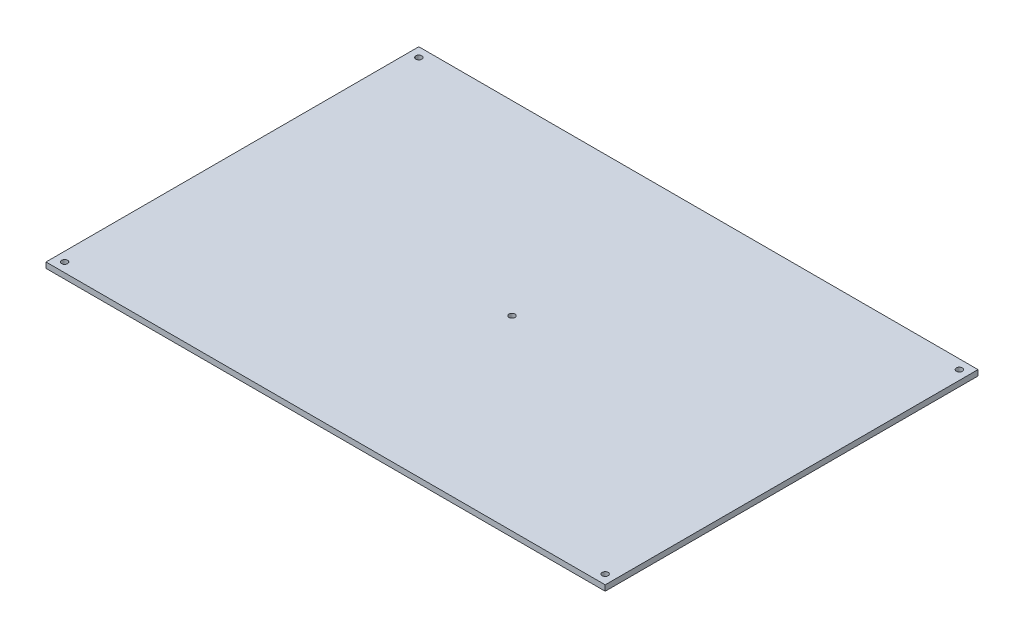
ISO-10303-21;
HEADER;
FILE_DESCRIPTION(('STEP AP214'),'2;1');
FILE_NAME('part.step','',(''),(''),'','','');
FILE_SCHEMA(('AUTOMOTIVE_DESIGN { 1 0 10303 214 1 1 1 1 }'));
ENDSEC;
DATA;
#1=APPLICATION_CONTEXT('core data for automotive mechanical design processes');
#2=APPLICATION_PROTOCOL_DEFINITION('international standard','automotive_design',2000,#1);
#3=PRODUCT_CONTEXT('',#1,'mechanical');
#4=PRODUCT('Part','Part','',(#3));
#5=PRODUCT_RELATED_PRODUCT_CATEGORY('part','',(#4));
#6=PRODUCT_DEFINITION_FORMATION('','',#4);
#7=PRODUCT_DEFINITION_CONTEXT('part definition',#1,'design');
#8=PRODUCT_DEFINITION('design','',#6,#7);
#9=PRODUCT_DEFINITION_SHAPE('','',#8);
#10=(LENGTH_UNIT() NAMED_UNIT(*) SI_UNIT(.MILLI.,.METRE.));
#11=(NAMED_UNIT(*) PLANE_ANGLE_UNIT() SI_UNIT($,.RADIAN.));
#12=(NAMED_UNIT(*) SI_UNIT($,.STERADIAN.) SOLID_ANGLE_UNIT());
#13=UNCERTAINTY_MEASURE_WITH_UNIT(LENGTH_MEASURE(1.E-05),#10,'distance_accuracy_value','');
#14=(GEOMETRIC_REPRESENTATION_CONTEXT(3) GLOBAL_UNCERTAINTY_ASSIGNED_CONTEXT((#13)) GLOBAL_UNIT_ASSIGNED_CONTEXT((#10,
#11,#12)) REPRESENTATION_CONTEXT('',''));
#15=CARTESIAN_POINT('',(0.,0.,0.));
#16=DIRECTION('',(0.,0.,1.));
#17=DIRECTION('',(1.,0.,0.));
#18=AXIS2_PLACEMENT_3D('',#15,#16,#17);
#19=CARTESIAN_POINT('',(150.,-3.,100.));
#20=DIRECTION('',(1.,0.,0.));
#21=DIRECTION('',(0.,0.,-1.));
#22=AXIS2_PLACEMENT_3D('',#19,#20,#21);
#23=PLANE('',#22);
#24=DIRECTION('',(0.,0.,-1.));
#25=VECTOR('',#24,1.);
#26=CARTESIAN_POINT('',(150.,0.,100.));
#27=LINE('',#26,#25);
#28=CARTESIAN_POINT('',(150.,0.,100.));
#29=VERTEX_POINT('',#28);
#30=CARTESIAN_POINT('',(150.,0.,-100.));
#31=VERTEX_POINT('',#30);
#32=EDGE_CURVE('E100',#29,#31,#27,.T.);
#33=ORIENTED_EDGE('',*,*,#32,.F.);
#34=DIRECTION('',(0.,1.,0.));
#35=VECTOR('',#34,1.);
#36=CARTESIAN_POINT('',(150.,-3.,100.));
#37=LINE('',#36,#35);
#38=CARTESIAN_POINT('',(150.,-3.,100.));
#39=VERTEX_POINT('',#38);
#40=EDGE_CURVE('E11',#39,#29,#37,.T.);
#41=ORIENTED_EDGE('',*,*,#40,.F.);
#42=DIRECTION('',(0.,0.,-1.));
#43=VECTOR('',#42,1.);
#44=CARTESIAN_POINT('',(150.,-3.,100.));
#45=LINE('',#44,#43);
#46=CARTESIAN_POINT('',(150.,-3.,-100.));
#47=VERTEX_POINT('',#46);
#48=EDGE_CURVE('E93',#39,#47,#45,.T.);
#49=ORIENTED_EDGE('',*,*,#48,.T.);
#50=DIRECTION('',(0.,1.,0.));
#51=VECTOR('',#50,1.);
#52=CARTESIAN_POINT('',(150.,-3.,-100.));
#53=LINE('',#52,#51);
#54=EDGE_CURVE('E38',#47,#31,#53,.T.);
#55=ORIENTED_EDGE('',*,*,#54,.T.);
#56=EDGE_LOOP('',(#33,#41,#49,#55));
#57=FACE_BOUND('',#56,.T.);
#58=ADVANCED_FACE('F35',(#57),#23,.T.);
#59=CARTESIAN_POINT('',(-150.,-3.,100.));
#60=DIRECTION('',(0.,0.,1.));
#61=DIRECTION('',(1.,0.,0.));
#62=AXIS2_PLACEMENT_3D('',#59,#60,#61);
#63=PLANE('',#62);
#64=DIRECTION('',(1.,0.,0.));
#65=VECTOR('',#64,1.);
#66=CARTESIAN_POINT('',(-150.,0.,100.));
#67=LINE('',#66,#65);
#68=CARTESIAN_POINT('',(-150.,0.,100.));
#69=VERTEX_POINT('',#68);
#70=EDGE_CURVE('E95',#69,#29,#67,.T.);
#71=ORIENTED_EDGE('',*,*,#70,.F.);
#72=DIRECTION('',(0.,1.,0.));
#73=VECTOR('',#72,1.);
#74=CARTESIAN_POINT('',(-150.,-3.,100.));
#75=LINE('',#74,#73);
#76=CARTESIAN_POINT('',(-150.,-3.,100.));
#77=VERTEX_POINT('',#76);
#78=EDGE_CURVE('E44',#77,#69,#75,.T.);
#79=ORIENTED_EDGE('',*,*,#78,.F.);
#80=DIRECTION('',(1.,0.,0.));
#81=VECTOR('',#80,1.);
#82=CARTESIAN_POINT('',(-150.,-3.,100.));
#83=LINE('',#82,#81);
#84=EDGE_CURVE('E90',#77,#39,#83,.T.);
#85=ORIENTED_EDGE('',*,*,#84,.T.);
#86=ORIENTED_EDGE('',*,*,#40,.T.);
#87=EDGE_LOOP('',(#71,#79,#85,#86));
#88=FACE_BOUND('',#87,.T.);
#89=ADVANCED_FACE('F111',(#88),#63,.T.);
#90=CARTESIAN_POINT('',(-150.,-3.,-100.));
#91=DIRECTION('',(-1.,0.,0.));
#92=DIRECTION('',(0.,0.,1.));
#93=AXIS2_PLACEMENT_3D('',#90,#91,#92);
#94=PLANE('',#93);
#95=DIRECTION('',(0.,0.,1.));
#96=VECTOR('',#95,1.);
#97=CARTESIAN_POINT('',(-150.,0.,-100.));
#98=LINE('',#97,#96);
#99=CARTESIAN_POINT('',(-150.,0.,-100.));
#100=VERTEX_POINT('',#99);
#101=EDGE_CURVE('E85',#100,#69,#98,.T.);
#102=ORIENTED_EDGE('',*,*,#101,.F.);
#103=DIRECTION('',(0.,1.,0.));
#104=VECTOR('',#103,1.);
#105=CARTESIAN_POINT('',(-150.,-3.,-100.));
#106=LINE('',#105,#104);
#107=CARTESIAN_POINT('',(-150.,-3.,-100.));
#108=VERTEX_POINT('',#107);
#109=EDGE_CURVE('E80',#108,#100,#106,.T.);
#110=ORIENTED_EDGE('',*,*,#109,.F.);
#111=DIRECTION('',(0.,0.,1.));
#112=VECTOR('',#111,1.);
#113=CARTESIAN_POINT('',(-150.,-3.,-100.));
#114=LINE('',#113,#112);
#115=EDGE_CURVE('E83',#108,#77,#114,.T.);
#116=ORIENTED_EDGE('',*,*,#115,.T.);
#117=ORIENTED_EDGE('',*,*,#78,.T.);
#118=EDGE_LOOP('',(#102,#110,#116,#117));
#119=FACE_BOUND('',#118,.T.);
#120=ADVANCED_FACE('F82',(#119),#94,.T.);
#121=CARTESIAN_POINT('',(150.,-3.,-100.));
#122=DIRECTION('',(0.,0.,-1.));
#123=DIRECTION('',(-1.,0.,0.));
#124=AXIS2_PLACEMENT_3D('',#121,#122,#123);
#125=PLANE('',#124);
#126=DIRECTION('',(-1.,0.,0.));
#127=VECTOR('',#126,1.);
#128=CARTESIAN_POINT('',(150.,0.,-100.));
#129=LINE('',#128,#127);
#130=EDGE_CURVE('E103',#31,#100,#129,.T.);
#131=ORIENTED_EDGE('',*,*,#130,.F.);
#132=ORIENTED_EDGE('',*,*,#54,.F.);
#133=DIRECTION('',(-1.,0.,0.));
#134=VECTOR('',#133,1.);
#135=CARTESIAN_POINT('',(150.,-3.,-100.));
#136=LINE('',#135,#134);
#137=EDGE_CURVE('E89',#47,#108,#136,.T.);
#138=ORIENTED_EDGE('',*,*,#137,.T.);
#139=ORIENTED_EDGE('',*,*,#109,.T.);
#140=EDGE_LOOP('',(#131,#132,#138,#139));
#141=FACE_BOUND('',#140,.T.);
#142=ADVANCED_FACE('F92',(#141),#125,.T.);
#143=CARTESIAN_POINT('',(0.,-3.,0.));
#144=DIRECTION('',(0.,1.,0.));
#145=DIRECTION('',(0.,0.,1.));
#146=AXIS2_PLACEMENT_3D('',#143,#144,#145);
#147=PLANE('',#146);
#148=CARTESIAN_POINT('',(-145.,-3.,-95.));
#149=DIRECTION('',(0.,1.,0.));
#150=DIRECTION('',(0.,0.,1.));
#151=AXIS2_PLACEMENT_3D('',#148,#149,#150);
#152=CIRCLE('',#151,1.59999999999999);
#153=CARTESIAN_POINT('',(-145.,-3.,-93.4));
#154=VERTEX_POINT('',#153);
#155=EDGE_CURVE('E156',#154,#154,#152,.T.);
#156=ORIENTED_EDGE('',*,*,#155,.T.);
#157=EDGE_LOOP('',(#156));
#158=FACE_BOUND('',#157,.T.);
#159=CARTESIAN_POINT('',(145.,-3.,-95.));
#160=DIRECTION('',(0.,1.,0.));
#161=DIRECTION('',(0.,0.,1.));
#162=AXIS2_PLACEMENT_3D('',#159,#160,#161);
#163=CIRCLE('',#162,1.59999999999999);
#164=CARTESIAN_POINT('',(145.,-3.,-93.4));
#165=VERTEX_POINT('',#164);
#166=EDGE_CURVE('E166',#165,#165,#163,.T.);
#167=ORIENTED_EDGE('',*,*,#166,.T.);
#168=EDGE_LOOP('',(#167));
#169=FACE_BOUND('',#168,.T.);
#170=CARTESIAN_POINT('',(145.,-3.,95.));
#171=DIRECTION('',(0.,1.,0.));
#172=DIRECTION('',(0.,0.,1.));
#173=AXIS2_PLACEMENT_3D('',#170,#171,#172);
#174=CIRCLE('',#173,1.59999999999999);
#175=CARTESIAN_POINT('',(145.,-3.,96.6));
#176=VERTEX_POINT('',#175);
#177=EDGE_CURVE('E172',#176,#176,#174,.T.);
#178=ORIENTED_EDGE('',*,*,#177,.T.);
#179=EDGE_LOOP('',(#178));
#180=FACE_BOUND('',#179,.T.);
#181=CARTESIAN_POINT('',(-145.,-3.,95.));
#182=DIRECTION('',(0.,1.,0.));
#183=DIRECTION('',(0.,0.,1.));
#184=AXIS2_PLACEMENT_3D('',#181,#182,#183);
#185=CIRCLE('',#184,1.59999999999999);
#186=CARTESIAN_POINT('',(-145.,-3.,96.6));
#187=VERTEX_POINT('',#186);
#188=EDGE_CURVE('E178',#187,#187,#185,.T.);
#189=ORIENTED_EDGE('',*,*,#188,.T.);
#190=EDGE_LOOP('',(#189));
#191=FACE_BOUND('',#190,.T.);
#192=CARTESIAN_POINT('',(0.,-3.,0.));
#193=DIRECTION('',(0.,1.,0.));
#194=DIRECTION('',(0.,0.,1.));
#195=AXIS2_PLACEMENT_3D('',#192,#193,#194);
#196=CIRCLE('',#195,1.6);
#197=CARTESIAN_POINT('',(0.,-3.,1.6));
#198=VERTEX_POINT('',#197);
#199=EDGE_CURVE('E104',#198,#198,#196,.T.);
#200=ORIENTED_EDGE('',*,*,#199,.T.);
#201=EDGE_LOOP('',(#200));
#202=FACE_BOUND('',#201,.T.);
#203=ORIENTED_EDGE('',*,*,#48,.F.);
#204=ORIENTED_EDGE('',*,*,#84,.F.);
#205=ORIENTED_EDGE('',*,*,#115,.F.);
#206=ORIENTED_EDGE('',*,*,#137,.F.);
#207=EDGE_LOOP('',(#203,#204,#205,#206));
#208=FACE_BOUND('',#207,.T.);
#209=ADVANCED_FACE('F88',(#158,#169,#180,#191,#202,#208),#147,.F.);
#210=CARTESIAN_POINT('',(0.,0.,0.));
#211=DIRECTION('',(0.,1.,0.));
#212=DIRECTION('',(0.,0.,1.));
#213=AXIS2_PLACEMENT_3D('',#210,#211,#212);
#214=PLANE('',#213);
#215=CARTESIAN_POINT('',(-145.,0.,-95.));
#216=DIRECTION('',(0.,1.,0.));
#217=DIRECTION('',(0.,0.,1.));
#218=AXIS2_PLACEMENT_3D('',#215,#216,#217);
#219=CIRCLE('',#218,1.59999999999999);
#220=CARTESIAN_POINT('',(-145.,0.,-93.4));
#221=VERTEX_POINT('',#220);
#222=EDGE_CURVE('E159',#221,#221,#219,.T.);
#223=ORIENTED_EDGE('',*,*,#222,.F.);
#224=EDGE_LOOP('',(#223));
#225=FACE_BOUND('',#224,.T.);
#226=CARTESIAN_POINT('',(145.,0.,-95.));
#227=DIRECTION('',(0.,1.,0.));
#228=DIRECTION('',(0.,0.,1.));
#229=AXIS2_PLACEMENT_3D('',#226,#227,#228);
#230=CIRCLE('',#229,1.59999999999999);
#231=CARTESIAN_POINT('',(145.,0.,-93.4));
#232=VERTEX_POINT('',#231);
#233=EDGE_CURVE('E161',#232,#232,#230,.T.);
#234=ORIENTED_EDGE('',*,*,#233,.F.);
#235=EDGE_LOOP('',(#234));
#236=FACE_BOUND('',#235,.T.);
#237=CARTESIAN_POINT('',(145.,0.,95.));
#238=DIRECTION('',(0.,1.,0.));
#239=DIRECTION('',(0.,0.,1.));
#240=AXIS2_PLACEMENT_3D('',#237,#238,#239);
#241=CIRCLE('',#240,1.59999999999999);
#242=CARTESIAN_POINT('',(145.,0.,96.6));
#243=VERTEX_POINT('',#242);
#244=EDGE_CURVE('E169',#243,#243,#241,.T.);
#245=ORIENTED_EDGE('',*,*,#244,.F.);
#246=EDGE_LOOP('',(#245));
#247=FACE_BOUND('',#246,.T.);
#248=CARTESIAN_POINT('',(-145.,0.,95.));
#249=DIRECTION('',(0.,1.,0.));
#250=DIRECTION('',(0.,0.,1.));
#251=AXIS2_PLACEMENT_3D('',#248,#249,#250);
#252=CIRCLE('',#251,1.59999999999999);
#253=CARTESIAN_POINT('',(-145.,0.,96.6));
#254=VERTEX_POINT('',#253);
#255=EDGE_CURVE('E175',#254,#254,#252,.T.);
#256=ORIENTED_EDGE('',*,*,#255,.F.);
#257=EDGE_LOOP('',(#256));
#258=FACE_BOUND('',#257,.T.);
#259=CARTESIAN_POINT('',(0.,0.,0.));
#260=DIRECTION('',(0.,1.,0.));
#261=DIRECTION('',(0.,0.,1.));
#262=AXIS2_PLACEMENT_3D('',#259,#260,#261);
#263=CIRCLE('',#262,1.59999999999999);
#264=CARTESIAN_POINT('',(0.,0.,1.59999999999999));
#265=VERTEX_POINT('',#264);
#266=EDGE_CURVE('E181',#265,#265,#263,.T.);
#267=ORIENTED_EDGE('',*,*,#266,.F.);
#268=EDGE_LOOP('',(#267));
#269=FACE_BOUND('',#268,.T.);
#270=ORIENTED_EDGE('',*,*,#32,.T.);
#271=ORIENTED_EDGE('',*,*,#130,.T.);
#272=ORIENTED_EDGE('',*,*,#101,.T.);
#273=ORIENTED_EDGE('',*,*,#70,.T.);
#274=EDGE_LOOP('',(#270,#271,#272,#273));
#275=FACE_BOUND('',#274,.T.);
#276=ADVANCED_FACE('F110',(#225,#236,#247,#258,#269,#275),#214,.T.);
#277=CARTESIAN_POINT('',(0.,0.,0.));
#278=DIRECTION('',(0.,1.,0.));
#279=DIRECTION('',(0.,0.,1.));
#280=AXIS2_PLACEMENT_3D('',#277,#278,#279);
#281=CYLINDRICAL_SURFACE('',#280,1.59999999999999);
#282=ORIENTED_EDGE('',*,*,#199,.F.);
#283=EDGE_LOOP('',(#282));
#284=FACE_BOUND('',#283,.T.);
#285=ORIENTED_EDGE('',*,*,#266,.T.);
#286=EDGE_LOOP('',(#285));
#287=FACE_BOUND('',#286,.T.);
#288=ADVANCED_FACE('F129',(#284,#287),#281,.F.);
#289=CARTESIAN_POINT('',(-145.,0.,95.));
#290=DIRECTION('',(0.,1.,0.));
#291=DIRECTION('',(0.,0.,1.));
#292=AXIS2_PLACEMENT_3D('',#289,#290,#291);
#293=CYLINDRICAL_SURFACE('',#292,1.59999999999999);
#294=ORIENTED_EDGE('',*,*,#188,.F.);
#295=EDGE_LOOP('',(#294));
#296=FACE_BOUND('',#295,.T.);
#297=ORIENTED_EDGE('',*,*,#255,.T.);
#298=EDGE_LOOP('',(#297));
#299=FACE_BOUND('',#298,.T.);
#300=ADVANCED_FACE('F136',(#296,#299),#293,.F.);
#301=CARTESIAN_POINT('',(145.,0.,95.));
#302=DIRECTION('',(0.,1.,0.));
#303=DIRECTION('',(0.,0.,1.));
#304=AXIS2_PLACEMENT_3D('',#301,#302,#303);
#305=CYLINDRICAL_SURFACE('',#304,1.59999999999999);
#306=ORIENTED_EDGE('',*,*,#177,.F.);
#307=EDGE_LOOP('',(#306));
#308=FACE_BOUND('',#307,.T.);
#309=ORIENTED_EDGE('',*,*,#244,.T.);
#310=EDGE_LOOP('',(#309));
#311=FACE_BOUND('',#310,.T.);
#312=ADVANCED_FACE('F140',(#308,#311),#305,.F.);
#313=CARTESIAN_POINT('',(145.,0.,-95.));
#314=DIRECTION('',(0.,1.,0.));
#315=DIRECTION('',(0.,0.,1.));
#316=AXIS2_PLACEMENT_3D('',#313,#314,#315);
#317=CYLINDRICAL_SURFACE('',#316,1.59999999999999);
#318=ORIENTED_EDGE('',*,*,#166,.F.);
#319=EDGE_LOOP('',(#318));
#320=FACE_BOUND('',#319,.T.);
#321=ORIENTED_EDGE('',*,*,#233,.T.);
#322=EDGE_LOOP('',(#321));
#323=FACE_BOUND('',#322,.T.);
#324=ADVANCED_FACE('F144',(#320,#323),#317,.F.);
#325=CARTESIAN_POINT('',(-145.,0.,-95.));
#326=DIRECTION('',(0.,1.,0.));
#327=DIRECTION('',(0.,0.,1.));
#328=AXIS2_PLACEMENT_3D('',#325,#326,#327);
#329=CYLINDRICAL_SURFACE('',#328,1.59999999999999);
#330=ORIENTED_EDGE('',*,*,#155,.F.);
#331=EDGE_LOOP('',(#330));
#332=FACE_BOUND('',#331,.T.);
#333=ORIENTED_EDGE('',*,*,#222,.T.);
#334=EDGE_LOOP('',(#333));
#335=FACE_BOUND('',#334,.T.);
#336=ADVANCED_FACE('F148',(#332,#335),#329,.F.);
#337=CLOSED_SHELL('',(#58,#89,#120,#142,#209,#276,#288,#300,#312,#324,#336));
#338=MANIFOLD_SOLID_BREP('B2',#337);
#339=ADVANCED_BREP_SHAPE_REPRESENTATION('',(#18,#338),#14);
#340=SHAPE_DEFINITION_REPRESENTATION(#9,#339);
ENDSEC;
END-ISO-10303-21;
